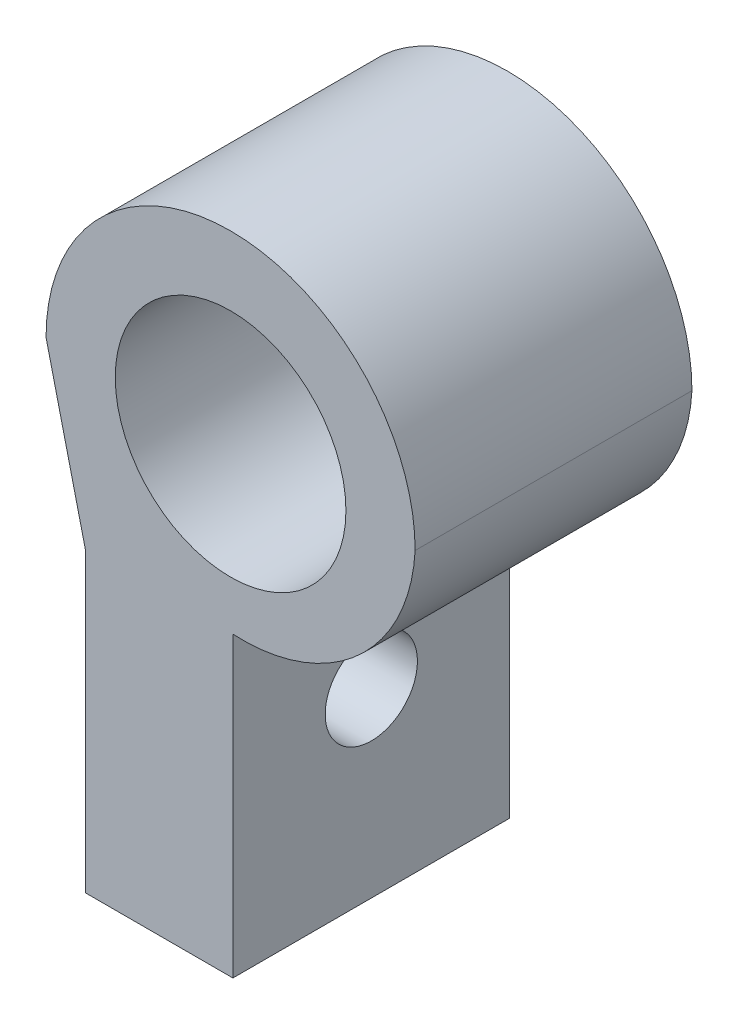
ISO-10303-21;
HEADER;
FILE_DESCRIPTION(('STEP AP214'),'2;1');
FILE_NAME('part.step','',(''),(''),'','','');
FILE_SCHEMA(('AUTOMOTIVE_DESIGN { 1 0 10303 214 1 1 1 1 }'));
ENDSEC;
DATA;
#1=APPLICATION_CONTEXT('core data for automotive mechanical design processes');
#2=APPLICATION_PROTOCOL_DEFINITION('international standard','automotive_design',2000,#1);
#3=PRODUCT_CONTEXT('',#1,'mechanical');
#4=PRODUCT('Part','Part','',(#3));
#5=PRODUCT_RELATED_PRODUCT_CATEGORY('part','',(#4));
#6=PRODUCT_DEFINITION_FORMATION('','',#4);
#7=PRODUCT_DEFINITION_CONTEXT('part definition',#1,'design');
#8=PRODUCT_DEFINITION('design','',#6,#7);
#9=PRODUCT_DEFINITION_SHAPE('','',#8);
#10=(LENGTH_UNIT() NAMED_UNIT(*) SI_UNIT(.MILLI.,.METRE.));
#11=(NAMED_UNIT(*) PLANE_ANGLE_UNIT() SI_UNIT($,.RADIAN.));
#12=(NAMED_UNIT(*) SI_UNIT($,.STERADIAN.) SOLID_ANGLE_UNIT());
#13=UNCERTAINTY_MEASURE_WITH_UNIT(LENGTH_MEASURE(1.E-05),#10,'distance_accuracy_value','');
#14=(GEOMETRIC_REPRESENTATION_CONTEXT(3) GLOBAL_UNCERTAINTY_ASSIGNED_CONTEXT((#13)) GLOBAL_UNIT_ASSIGNED_CONTEXT((#10,
#11,#12)) REPRESENTATION_CONTEXT('',''));
#15=CARTESIAN_POINT('',(0.,0.,0.));
#16=DIRECTION('',(0.,0.,1.));
#17=DIRECTION('',(1.,0.,0.));
#18=AXIS2_PLACEMENT_3D('',#15,#16,#17);
#19=CARTESIAN_POINT('',(0.252370421844233,0.202370421844343,6.));
#20=DIRECTION('',(0.,0.,1.));
#21=DIRECTION('',(1.,0.,0.));
#22=AXIS2_PLACEMENT_3D('',#19,#20,#21);
#23=PLANE('',#22);
#24=DIRECTION('',(1.,0.,0.));
#25=VECTOR('',#24,1.);
#26=CARTESIAN_POINT('',(-3.15,-10.,6.));
#27=LINE('',#26,#25);
#28=CARTESIAN_POINT('',(-3.15,-10.,6.));
#29=VERTEX_POINT('',#28);
#30=CARTESIAN_POINT('',(0.0500000000000001,-10.,6.));
#31=VERTEX_POINT('',#30);
#32=EDGE_CURVE('E129',#29,#31,#27,.T.);
#33=ORIENTED_EDGE('',*,*,#32,.T.);
#34=DIRECTION('',(0.,1.,0.));
#35=VECTOR('',#34,1.);
#36=CARTESIAN_POINT('',(0.0500000000000001,-10.,6.));
#37=LINE('',#36,#35);
#38=CARTESIAN_POINT('',(0.0499999999999984,-3.54525915631143,6.));
#39=VERTEX_POINT('',#38);
#40=EDGE_CURVE('E87',#31,#39,#37,.T.);
#41=ORIENTED_EDGE('',*,*,#40,.T.);
#42=CARTESIAN_POINT('',(0.252370421844233,0.202370421844343,6.));
#43=DIRECTION('',(0.,0.,1.));
#44=DIRECTION('',(1.,0.,0.));
#45=AXIS2_PLACEMENT_3D('',#42,#43,#44);
#46=CIRCLE('',#45,3.75308955964355);
#47=CARTESIAN_POINT('',(4.,0.,6.));
#48=VERTEX_POINT('',#47);
#49=EDGE_CURVE('E100',#39,#48,#46,.T.);
#50=ORIENTED_EDGE('',*,*,#49,.T.);
#51=CARTESIAN_POINT('',(0.,0.,6.));
#52=DIRECTION('',(0.,0.,1.));
#53=DIRECTION('',(1.,0.,0.));
#54=AXIS2_PLACEMENT_3D('',#51,#52,#53);
#55=CIRCLE('',#54,4.);
#56=CARTESIAN_POINT('',(-4.,0.,6.));
#57=VERTEX_POINT('',#56);
#58=EDGE_CURVE('E94',#48,#57,#55,.T.);
#59=ORIENTED_EDGE('',*,*,#58,.T.);
#60=DIRECTION('',(0.23314933148941,-0.972440943824375,0.));
#61=VECTOR('',#60,1.);
#62=CARTESIAN_POINT('',(-3.15,-3.54525915631143,6.));
#63=LINE('',#62,#61);
#64=CARTESIAN_POINT('',(-3.15,-3.54525915631143,6.));
#65=VERTEX_POINT('',#64);
#66=EDGE_CURVE('E98',#57,#65,#63,.T.);
#67=ORIENTED_EDGE('',*,*,#66,.T.);
#68=DIRECTION('',(0.,-1.,0.));
#69=VECTOR('',#68,1.);
#70=CARTESIAN_POINT('',(-3.15,-10.,6.));
#71=LINE('',#70,#69);
#72=EDGE_CURVE('E50',#65,#29,#71,.T.);
#73=ORIENTED_EDGE('',*,*,#72,.T.);
#74=EDGE_LOOP('',(#33,#41,#50,#59,#67,#73));
#75=FACE_BOUND('',#74,.T.);
#76=CARTESIAN_POINT('',(0.,0.,6.));
#77=DIRECTION('',(0.,0.,1.));
#78=DIRECTION('',(1.,0.,0.));
#79=AXIS2_PLACEMENT_3D('',#76,#77,#78);
#80=CIRCLE('',#79,2.5);
#81=CARTESIAN_POINT('',(2.5,0.,6.));
#82=VERTEX_POINT('',#81);
#83=EDGE_CURVE('E122',#82,#82,#80,.T.);
#84=ORIENTED_EDGE('',*,*,#83,.F.);
#85=EDGE_LOOP('',(#84));
#86=FACE_BOUND('',#85,.T.);
#87=ADVANCED_FACE('F33',(#75,#86),#23,.T.);
#88=CARTESIAN_POINT('',(0.252370421844233,0.202370421844343,0.));
#89=DIRECTION('',(0.,0.,1.));
#90=DIRECTION('',(1.,0.,0.));
#91=AXIS2_PLACEMENT_3D('',#88,#89,#90);
#92=PLANE('',#91);
#93=DIRECTION('',(1.,0.,0.));
#94=VECTOR('',#93,1.);
#95=CARTESIAN_POINT('',(-3.15,-10.,0.));
#96=LINE('',#95,#94);
#97=CARTESIAN_POINT('',(-3.15,-10.,0.));
#98=VERTEX_POINT('',#97);
#99=CARTESIAN_POINT('',(0.0500000000000001,-10.,0.));
#100=VERTEX_POINT('',#99);
#101=EDGE_CURVE('E118',#98,#100,#96,.T.);
#102=ORIENTED_EDGE('',*,*,#101,.F.);
#103=DIRECTION('',(0.,-1.,0.));
#104=VECTOR('',#103,1.);
#105=CARTESIAN_POINT('',(-3.15,-10.,0.));
#106=LINE('',#105,#104);
#107=CARTESIAN_POINT('',(-3.15,-3.54525915631143,0.));
#108=VERTEX_POINT('',#107);
#109=EDGE_CURVE('E79',#108,#98,#106,.T.);
#110=ORIENTED_EDGE('',*,*,#109,.F.);
#111=DIRECTION('',(0.23314933148941,-0.972440943824375,0.));
#112=VECTOR('',#111,1.);
#113=CARTESIAN_POINT('',(-3.15,-3.54525915631143,0.));
#114=LINE('',#113,#112);
#115=CARTESIAN_POINT('',(-4.,0.,0.));
#116=VERTEX_POINT('',#115);
#117=EDGE_CURVE('E73',#116,#108,#114,.T.);
#118=ORIENTED_EDGE('',*,*,#117,.F.);
#119=CARTESIAN_POINT('',(0.,0.,0.));
#120=DIRECTION('',(0.,0.,1.));
#121=DIRECTION('',(1.,0.,0.));
#122=AXIS2_PLACEMENT_3D('',#119,#120,#121);
#123=CIRCLE('',#122,4.);
#124=CARTESIAN_POINT('',(4.,0.,0.));
#125=VERTEX_POINT('',#124);
#126=EDGE_CURVE('E108',#125,#116,#123,.T.);
#127=ORIENTED_EDGE('',*,*,#126,.F.);
#128=CARTESIAN_POINT('',(0.252370421844233,0.202370421844343,0.));
#129=DIRECTION('',(0.,0.,1.));
#130=DIRECTION('',(1.,0.,0.));
#131=AXIS2_PLACEMENT_3D('',#128,#129,#130);
#132=CIRCLE('',#131,3.75308955964355);
#133=CARTESIAN_POINT('',(0.0499999999999984,-3.54525915631143,0.));
#134=VERTEX_POINT('',#133);
#135=EDGE_CURVE('E124',#134,#125,#132,.T.);
#136=ORIENTED_EDGE('',*,*,#135,.F.);
#137=DIRECTION('',(0.,1.,0.));
#138=VECTOR('',#137,1.);
#139=CARTESIAN_POINT('',(0.0500000000000001,-10.,0.));
#140=LINE('',#139,#138);
#141=EDGE_CURVE('E121',#100,#134,#140,.T.);
#142=ORIENTED_EDGE('',*,*,#141,.F.);
#143=EDGE_LOOP('',(#102,#110,#118,#127,#136,#142));
#144=FACE_BOUND('',#143,.T.);
#145=CARTESIAN_POINT('',(0.,0.,0.));
#146=DIRECTION('',(0.,0.,1.));
#147=DIRECTION('',(1.,0.,0.));
#148=AXIS2_PLACEMENT_3D('',#145,#146,#147);
#149=CIRCLE('',#148,2.5);
#150=CARTESIAN_POINT('',(2.5,0.,0.));
#151=VERTEX_POINT('',#150);
#152=EDGE_CURVE('E176',#151,#151,#149,.T.);
#153=ORIENTED_EDGE('',*,*,#152,.T.);
#154=EDGE_LOOP('',(#153));
#155=FACE_BOUND('',#154,.T.);
#156=ADVANCED_FACE('F138',(#144,#155),#92,.F.);
#157=CARTESIAN_POINT('',(-3.15,-10.,6.));
#158=DIRECTION('',(0.,1.,0.));
#159=DIRECTION('',(0.,0.,1.));
#160=AXIS2_PLACEMENT_3D('',#157,#158,#159);
#161=PLANE('',#160);
#162=ORIENTED_EDGE('',*,*,#101,.T.);
#163=DIRECTION('',(0.,0.,-1.));
#164=VECTOR('',#163,1.);
#165=CARTESIAN_POINT('',(0.0500000000000001,-10.,6.));
#166=LINE('',#165,#164);
#167=EDGE_CURVE('E11',#31,#100,#166,.T.);
#168=ORIENTED_EDGE('',*,*,#167,.F.);
#169=ORIENTED_EDGE('',*,*,#32,.F.);
#170=DIRECTION('',(0.,0.,-1.));
#171=VECTOR('',#170,1.);
#172=CARTESIAN_POINT('',(-3.15,-10.,6.));
#173=LINE('',#172,#171);
#174=EDGE_CURVE('E114',#29,#98,#173,.T.);
#175=ORIENTED_EDGE('',*,*,#174,.T.);
#176=EDGE_LOOP('',(#162,#168,#169,#175));
#177=FACE_BOUND('',#176,.T.);
#178=ADVANCED_FACE('F35',(#177),#161,.F.);
#179=CARTESIAN_POINT('',(0.0500000000000001,-10.,6.));
#180=DIRECTION('',(-1.,0.,0.));
#181=DIRECTION('',(0.,0.,1.));
#182=AXIS2_PLACEMENT_3D('',#179,#180,#181);
#183=PLANE('',#182);
#184=CARTESIAN_POINT('',(0.0500000000000001,-6.05071913779921,3.));
#185=DIRECTION('',(1.,0.,0.));
#186=DIRECTION('',(0.,0.,-1.));
#187=AXIS2_PLACEMENT_3D('',#184,#185,#186);
#188=CIRCLE('',#187,1.);
#189=CARTESIAN_POINT('',(0.0500000000000001,-6.05071913779921,2.));
#190=VERTEX_POINT('',#189);
#191=EDGE_CURVE('E173',#190,#190,#188,.T.);
#192=ORIENTED_EDGE('',*,*,#191,.F.);
#193=EDGE_LOOP('',(#192));
#194=FACE_BOUND('',#193,.T.);
#195=ORIENTED_EDGE('',*,*,#141,.T.);
#196=DIRECTION('',(0.,0.,-1.));
#197=VECTOR('',#196,1.);
#198=CARTESIAN_POINT('',(0.0499999999999984,-3.54525915631143,6.));
#199=LINE('',#198,#197);
#200=EDGE_CURVE('E42',#39,#134,#199,.T.);
#201=ORIENTED_EDGE('',*,*,#200,.F.);
#202=ORIENTED_EDGE('',*,*,#40,.F.);
#203=ORIENTED_EDGE('',*,*,#167,.T.);
#204=EDGE_LOOP('',(#195,#201,#202,#203));
#205=FACE_BOUND('',#204,.T.);
#206=ADVANCED_FACE('F187',(#194,#205),#183,.F.);
#207=CARTESIAN_POINT('',(0.252370421844233,0.202370421844343,6.));
#208=DIRECTION('',(0.,0.,-1.));
#209=DIRECTION('',(-1.,0.,0.));
#210=AXIS2_PLACEMENT_3D('',#207,#208,#209);
#211=CYLINDRICAL_SURFACE('',#210,3.75308955964355);
#212=ORIENTED_EDGE('',*,*,#135,.T.);
#213=DIRECTION('',(0.,0.,-1.));
#214=VECTOR('',#213,1.);
#215=CARTESIAN_POINT('',(4.,0.,6.));
#216=LINE('',#215,#214);
#217=EDGE_CURVE('E109',#48,#125,#216,.T.);
#218=ORIENTED_EDGE('',*,*,#217,.F.);
#219=ORIENTED_EDGE('',*,*,#49,.F.);
#220=ORIENTED_EDGE('',*,*,#200,.T.);
#221=EDGE_LOOP('',(#212,#218,#219,#220));
#222=FACE_BOUND('',#221,.T.);
#223=ADVANCED_FACE('F135',(#222),#211,.T.);
#224=CARTESIAN_POINT('',(0.,0.,6.));
#225=DIRECTION('',(0.,0.,-1.));
#226=DIRECTION('',(-1.,0.,0.));
#227=AXIS2_PLACEMENT_3D('',#224,#225,#226);
#228=CYLINDRICAL_SURFACE('',#227,4.);
#229=ORIENTED_EDGE('',*,*,#126,.T.);
#230=DIRECTION('',(0.,0.,-1.));
#231=VECTOR('',#230,1.);
#232=CARTESIAN_POINT('',(-4.,0.,6.));
#233=LINE('',#232,#231);
#234=EDGE_CURVE('E105',#57,#116,#233,.T.);
#235=ORIENTED_EDGE('',*,*,#234,.F.);
#236=ORIENTED_EDGE('',*,*,#58,.F.);
#237=ORIENTED_EDGE('',*,*,#217,.T.);
#238=EDGE_LOOP('',(#229,#235,#236,#237));
#239=FACE_BOUND('',#238,.T.);
#240=ADVANCED_FACE('F106',(#239),#228,.T.);
#241=CARTESIAN_POINT('',(-3.15,-3.54525915631143,6.));
#242=DIRECTION('',(0.972440943824375,0.23314933148941,0.));
#243=DIRECTION('',(-0.23314933148941,0.972440943824375,0.));
#244=AXIS2_PLACEMENT_3D('',#241,#242,#243);
#245=PLANE('',#244);
#246=ORIENTED_EDGE('',*,*,#117,.T.);
#247=DIRECTION('',(0.,0.,-1.));
#248=VECTOR('',#247,1.);
#249=CARTESIAN_POINT('',(-3.15,-3.54525915631143,6.));
#250=LINE('',#249,#248);
#251=EDGE_CURVE('E110',#65,#108,#250,.T.);
#252=ORIENTED_EDGE('',*,*,#251,.F.);
#253=ORIENTED_EDGE('',*,*,#66,.F.);
#254=ORIENTED_EDGE('',*,*,#234,.T.);
#255=EDGE_LOOP('',(#246,#252,#253,#254));
#256=FACE_BOUND('',#255,.T.);
#257=ADVANCED_FACE('F112',(#256),#245,.F.);
#258=CARTESIAN_POINT('',(-3.15,-10.,6.));
#259=DIRECTION('',(1.,0.,0.));
#260=DIRECTION('',(0.,0.,-1.));
#261=AXIS2_PLACEMENT_3D('',#258,#259,#260);
#262=PLANE('',#261);
#263=CARTESIAN_POINT('',(-3.15,-6.05071913779921,3.));
#264=DIRECTION('',(1.,0.,0.));
#265=DIRECTION('',(0.,0.,-1.));
#266=AXIS2_PLACEMENT_3D('',#263,#264,#265);
#267=CIRCLE('',#266,1.);
#268=CARTESIAN_POINT('',(-3.15,-6.05071913779921,2.));
#269=VERTEX_POINT('',#268);
#270=EDGE_CURVE('E170',#269,#269,#267,.T.);
#271=ORIENTED_EDGE('',*,*,#270,.T.);
#272=EDGE_LOOP('',(#271));
#273=FACE_BOUND('',#272,.T.);
#274=ORIENTED_EDGE('',*,*,#109,.T.);
#275=ORIENTED_EDGE('',*,*,#174,.F.);
#276=ORIENTED_EDGE('',*,*,#72,.F.);
#277=ORIENTED_EDGE('',*,*,#251,.T.);
#278=EDGE_LOOP('',(#274,#275,#276,#277));
#279=FACE_BOUND('',#278,.T.);
#280=ADVANCED_FACE('F143',(#273,#279),#262,.F.);
#281=CARTESIAN_POINT('',(0.,0.,6.));
#282=DIRECTION('',(0.,0.,-1.));
#283=DIRECTION('',(-1.,0.,0.));
#284=AXIS2_PLACEMENT_3D('',#281,#282,#283);
#285=CYLINDRICAL_SURFACE('',#284,2.5);
#286=ORIENTED_EDGE('',*,*,#83,.T.);
#287=EDGE_LOOP('',(#286));
#288=FACE_BOUND('',#287,.T.);
#289=ORIENTED_EDGE('',*,*,#152,.F.);
#290=EDGE_LOOP('',(#289));
#291=FACE_BOUND('',#290,.T.);
#292=ADVANCED_FACE('F145',(#288,#291),#285,.F.);
#293=CARTESIAN_POINT('',(-3.15,-6.05071913779921,3.));
#294=DIRECTION('',(1.,0.,0.));
#295=DIRECTION('',(0.,0.,-1.));
#296=AXIS2_PLACEMENT_3D('',#293,#294,#295);
#297=CYLINDRICAL_SURFACE('',#296,1.);
#298=ORIENTED_EDGE('',*,*,#270,.F.);
#299=EDGE_LOOP('',(#298));
#300=FACE_BOUND('',#299,.T.);
#301=ORIENTED_EDGE('',*,*,#191,.T.);
#302=EDGE_LOOP('',(#301));
#303=FACE_BOUND('',#302,.T.);
#304=ADVANCED_FACE('F152',(#300,#303),#297,.F.);
#305=CLOSED_SHELL('',(#87,#156,#178,#206,#223,#240,#257,#280,#292,#304));
#306=MANIFOLD_SOLID_BREP('B2',#305);
#307=ADVANCED_BREP_SHAPE_REPRESENTATION('',(#18,#306),#14);
#308=SHAPE_DEFINITION_REPRESENTATION(#9,#307);
ENDSEC;
END-ISO-10303-21;
